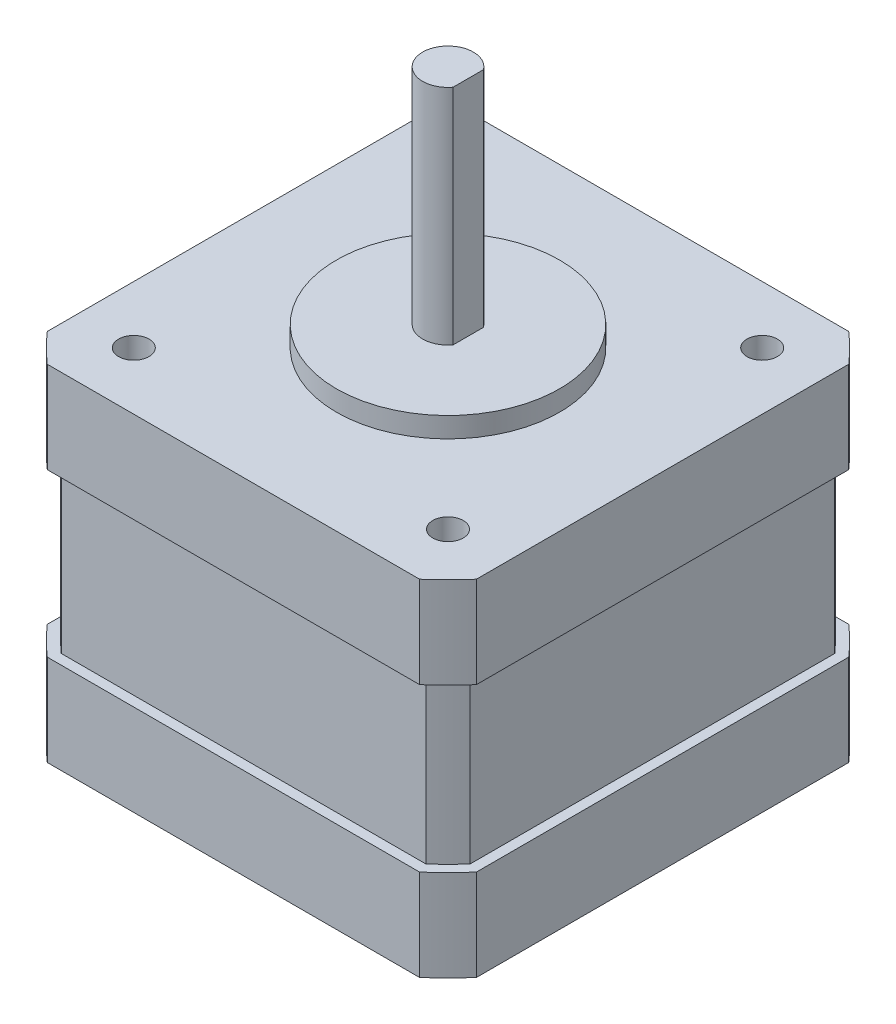
ISO-10303-21;
HEADER;
FILE_DESCRIPTION(('STEP AP214'),'2;1');
FILE_NAME('part.step','',(''),(''),'','','');
FILE_SCHEMA(('AUTOMOTIVE_DESIGN { 1 0 10303 214 1 1 1 1 }'));
ENDSEC;
DATA;
#1=APPLICATION_CONTEXT('core data for automotive mechanical design processes');
#2=APPLICATION_PROTOCOL_DEFINITION('international standard','automotive_design',2000,#1);
#3=PRODUCT_CONTEXT('',#1,'mechanical');
#4=PRODUCT('Part','Part','',(#3));
#5=PRODUCT_RELATED_PRODUCT_CATEGORY('part','',(#4));
#6=PRODUCT_DEFINITION_FORMATION('','',#4);
#7=PRODUCT_DEFINITION_CONTEXT('part definition',#1,'design');
#8=PRODUCT_DEFINITION('design','',#6,#7);
#9=PRODUCT_DEFINITION_SHAPE('','',#8);
#10=(LENGTH_UNIT() NAMED_UNIT(*) SI_UNIT(.MILLI.,.METRE.));
#11=(NAMED_UNIT(*) PLANE_ANGLE_UNIT() SI_UNIT($,.RADIAN.));
#12=(NAMED_UNIT(*) SI_UNIT($,.STERADIAN.) SOLID_ANGLE_UNIT());
#13=UNCERTAINTY_MEASURE_WITH_UNIT(LENGTH_MEASURE(1.E-05),#10,'distance_accuracy_value','');
#14=(GEOMETRIC_REPRESENTATION_CONTEXT(3) GLOBAL_UNCERTAINTY_ASSIGNED_CONTEXT((#13)) GLOBAL_UNIT_ASSIGNED_CONTEXT((#10,
#11,#12)) REPRESENTATION_CONTEXT('',''));
#15=CARTESIAN_POINT('',(0.,0.,0.));
#16=DIRECTION('',(0.,0.,1.));
#17=DIRECTION('',(1.,0.,0.));
#18=AXIS2_PLACEMENT_3D('',#15,#16,#17);
#19=CARTESIAN_POINT('',(0.,-9.,0.));
#20=DIRECTION('',(0.,1.,0.));
#21=DIRECTION('',(0.,0.,1.));
#22=AXIS2_PLACEMENT_3D('',#19,#20,#21);
#23=PLANE('',#22);
#24=CARTESIAN_POINT('',(0.,-9.,0.));
#25=DIRECTION('',(0.,1.,0.));
#26=DIRECTION('',(0.,0.,1.));
#27=AXIS2_PLACEMENT_3D('',#24,#25,#26);
#28=CIRCLE('',#27,28.);
#29=CARTESIAN_POINT('',(21.15,-9.,-18.3487738009928));
#30=VERTEX_POINT('',#29);
#31=CARTESIAN_POINT('',(18.3487738009928,-9.,-21.15));
#32=VERTEX_POINT('',#31);
#33=EDGE_CURVE('E304',#30,#32,#28,.T.);
#34=ORIENTED_EDGE('',*,*,#33,.F.);
#35=DIRECTION('',(0.,0.,-1.));
#36=VECTOR('',#35,1.);
#37=CARTESIAN_POINT('',(21.15,-9.,-18.3487738009928));
#38=LINE('',#37,#36);
#39=CARTESIAN_POINT('',(21.15,-9.,18.3487738009928));
#40=VERTEX_POINT('',#39);
#41=EDGE_CURVE('E326',#40,#30,#38,.T.);
#42=ORIENTED_EDGE('',*,*,#41,.F.);
#43=CARTESIAN_POINT('',(0.,-9.,0.));
#44=DIRECTION('',(0.,1.,0.));
#45=DIRECTION('',(0.,0.,1.));
#46=AXIS2_PLACEMENT_3D('',#43,#44,#45);
#47=CIRCLE('',#46,28.);
#48=CARTESIAN_POINT('',(18.3487738009928,-9.,21.15));
#49=VERTEX_POINT('',#48);
#50=EDGE_CURVE('E323',#49,#40,#47,.T.);
#51=ORIENTED_EDGE('',*,*,#50,.F.);
#52=DIRECTION('',(1.,0.,0.));
#53=VECTOR('',#52,1.);
#54=CARTESIAN_POINT('',(-18.3487738009928,-9.,21.15));
#55=LINE('',#54,#53);
#56=CARTESIAN_POINT('',(-18.3487738009928,-9.,21.15));
#57=VERTEX_POINT('',#56);
#58=EDGE_CURVE('E320',#57,#49,#55,.T.);
#59=ORIENTED_EDGE('',*,*,#58,.F.);
#60=CARTESIAN_POINT('',(0.,-9.,0.));
#61=DIRECTION('',(0.,1.,0.));
#62=DIRECTION('',(0.,0.,1.));
#63=AXIS2_PLACEMENT_3D('',#60,#61,#62);
#64=CIRCLE('',#63,28.);
#65=CARTESIAN_POINT('',(-21.15,-9.,18.3487738009928));
#66=VERTEX_POINT('',#65);
#67=EDGE_CURVE('E317',#66,#57,#64,.T.);
#68=ORIENTED_EDGE('',*,*,#67,.F.);
#69=DIRECTION('',(0.,0.,1.));
#70=VECTOR('',#69,1.);
#71=CARTESIAN_POINT('',(-21.15,-9.,-18.3487738009928));
#72=LINE('',#71,#70);
#73=CARTESIAN_POINT('',(-21.15,-9.,-18.3487738009928));
#74=VERTEX_POINT('',#73);
#75=EDGE_CURVE('E314',#74,#66,#72,.T.);
#76=ORIENTED_EDGE('',*,*,#75,.F.);
#77=CARTESIAN_POINT('',(0.,-9.,0.));
#78=DIRECTION('',(0.,1.,0.));
#79=DIRECTION('',(0.,0.,1.));
#80=AXIS2_PLACEMENT_3D('',#77,#78,#79);
#81=CIRCLE('',#80,28.);
#82=CARTESIAN_POINT('',(-18.3487738009928,-9.,-21.15));
#83=VERTEX_POINT('',#82);
#84=EDGE_CURVE('E311',#83,#74,#81,.T.);
#85=ORIENTED_EDGE('',*,*,#84,.F.);
#86=DIRECTION('',(-1.,0.,0.));
#87=VECTOR('',#86,1.);
#88=CARTESIAN_POINT('',(-18.3487738009928,-9.,-21.15));
#89=LINE('',#88,#87);
#90=EDGE_CURVE('E307',#32,#83,#89,.T.);
#91=ORIENTED_EDGE('',*,*,#90,.F.);
#92=EDGE_LOOP('',(#34,#42,#51,#59,#68,#76,#85,#91));
#93=FACE_BOUND('',#92,.T.);
#94=CARTESIAN_POINT('',(0.,-9.,0.));
#95=DIRECTION('',(0.,-1.,0.));
#96=DIRECTION('',(0.,0.,-1.));
#97=AXIS2_PLACEMENT_3D('',#94,#95,#96);
#98=CIRCLE('',#97,27.);
#99=CARTESIAN_POINT('',(17.9715747779653,-9.,-20.15));
#100=VERTEX_POINT('',#99);
#101=CARTESIAN_POINT('',(20.15,-9.,-17.9715747779653));
#102=VERTEX_POINT('',#101);
#103=EDGE_CURVE('E231',#100,#102,#98,.T.);
#104=ORIENTED_EDGE('',*,*,#103,.F.);
#105=DIRECTION('',(1.,0.,0.));
#106=VECTOR('',#105,1.);
#107=CARTESIAN_POINT('',(-17.9715747779654,-9.,-20.15));
#108=LINE('',#107,#106);
#109=CARTESIAN_POINT('',(-17.9715747779654,-9.,-20.15));
#110=VERTEX_POINT('',#109);
#111=EDGE_CURVE('E243',#110,#100,#108,.T.);
#112=ORIENTED_EDGE('',*,*,#111,.F.);
#113=CARTESIAN_POINT('',(0.,-9.,0.));
#114=DIRECTION('',(0.,-1.,0.));
#115=DIRECTION('',(0.,0.,-1.));
#116=AXIS2_PLACEMENT_3D('',#113,#114,#115);
#117=CIRCLE('',#116,27.);
#118=CARTESIAN_POINT('',(-20.15,-9.,-17.9715747779653));
#119=VERTEX_POINT('',#118);
#120=EDGE_CURVE('E276',#119,#110,#117,.T.);
#121=ORIENTED_EDGE('',*,*,#120,.F.);
#122=DIRECTION('',(0.,0.,-1.));
#123=VECTOR('',#122,1.);
#124=CARTESIAN_POINT('',(-20.15,-9.,17.9715747779653));
#125=LINE('',#124,#123);
#126=CARTESIAN_POINT('',(-20.15,-9.,17.9715747779653));
#127=VERTEX_POINT('',#126);
#128=EDGE_CURVE('E273',#127,#119,#125,.T.);
#129=ORIENTED_EDGE('',*,*,#128,.F.);
#130=CARTESIAN_POINT('',(0.,-9.,0.));
#131=DIRECTION('',(0.,-1.,0.));
#132=DIRECTION('',(0.,0.,-1.));
#133=AXIS2_PLACEMENT_3D('',#130,#131,#132);
#134=CIRCLE('',#133,27.);
#135=CARTESIAN_POINT('',(-17.9715747779654,-9.,20.15));
#136=VERTEX_POINT('',#135);
#137=EDGE_CURVE('E270',#136,#127,#134,.T.);
#138=ORIENTED_EDGE('',*,*,#137,.F.);
#139=DIRECTION('',(-1.,0.,0.));
#140=VECTOR('',#139,1.);
#141=CARTESIAN_POINT('',(17.9715747779653,-9.,20.15));
#142=LINE('',#141,#140);
#143=CARTESIAN_POINT('',(17.9715747779653,-9.,20.15));
#144=VERTEX_POINT('',#143);
#145=EDGE_CURVE('E267',#144,#136,#142,.T.);
#146=ORIENTED_EDGE('',*,*,#145,.F.);
#147=CARTESIAN_POINT('',(0.,-9.,0.));
#148=DIRECTION('',(0.,-1.,0.));
#149=DIRECTION('',(0.,0.,-1.));
#150=AXIS2_PLACEMENT_3D('',#147,#148,#149);
#151=CIRCLE('',#150,27.);
#152=CARTESIAN_POINT('',(20.15,-9.,17.9715747779653));
#153=VERTEX_POINT('',#152);
#154=EDGE_CURVE('E55',#153,#144,#151,.T.);
#155=ORIENTED_EDGE('',*,*,#154,.F.);
#156=DIRECTION('',(0.,0.,1.));
#157=VECTOR('',#156,1.);
#158=CARTESIAN_POINT('',(20.15,-9.,-17.9715747779653));
#159=LINE('',#158,#157);
#160=EDGE_CURVE('E50',#102,#153,#159,.T.);
#161=ORIENTED_EDGE('',*,*,#160,.F.);
#162=EDGE_LOOP('',(#104,#112,#121,#129,#138,#146,#155,#161));
#163=FACE_BOUND('',#162,.T.);
#164=ADVANCED_FACE('F35',(#93,#163),#23,.F.);
#165=CARTESIAN_POINT('',(0.,24.,0.));
#166=DIRECTION('',(0.,-1.,0.));
#167=DIRECTION('',(0.,0.,-1.));
#168=AXIS2_PLACEMENT_3D('',#165,#166,#167);
#169=CYLINDRICAL_SURFACE('',#168,2.5);
#170=DIRECTION('',(0.,-1.,0.));
#171=VECTOR('',#170,1.);
#172=CARTESIAN_POINT('',(2.,24.,-1.5));
#173=LINE('',#172,#171);
#174=CARTESIAN_POINT('',(2.,24.,-1.5));
#175=VERTEX_POINT('',#174);
#176=CARTESIAN_POINT('',(2.,2.,-1.5));
#177=VERTEX_POINT('',#176);
#178=EDGE_CURVE('E381',#175,#177,#173,.T.);
#179=ORIENTED_EDGE('',*,*,#178,.T.);
#180=CARTESIAN_POINT('',(0.,2.,0.));
#181=DIRECTION('',(0.,1.,0.));
#182=DIRECTION('',(0.,0.,1.));
#183=AXIS2_PLACEMENT_3D('',#180,#181,#182);
#184=CIRCLE('',#183,2.5);
#185=CARTESIAN_POINT('',(2.,2.,1.5));
#186=VERTEX_POINT('',#185);
#187=EDGE_CURVE('E373',#177,#186,#184,.T.);
#188=ORIENTED_EDGE('',*,*,#187,.T.);
#189=DIRECTION('',(0.,-1.,0.));
#190=VECTOR('',#189,1.);
#191=CARTESIAN_POINT('',(2.,24.,1.5));
#192=LINE('',#191,#190);
#193=CARTESIAN_POINT('',(2.,24.,1.5));
#194=VERTEX_POINT('',#193);
#195=EDGE_CURVE('E43',#194,#186,#192,.T.);
#196=ORIENTED_EDGE('',*,*,#195,.F.);
#197=CARTESIAN_POINT('',(0.,24.,0.));
#198=DIRECTION('',(0.,1.,0.));
#199=DIRECTION('',(0.,0.,1.));
#200=AXIS2_PLACEMENT_3D('',#197,#198,#199);
#201=CIRCLE('',#200,2.5);
#202=EDGE_CURVE('E376',#175,#194,#201,.T.);
#203=ORIENTED_EDGE('',*,*,#202,.F.);
#204=EDGE_LOOP('',(#179,#188,#196,#203));
#205=FACE_BOUND('',#204,.T.);
#206=ADVANCED_FACE('F37',(#205),#169,.T.);
#207=CARTESIAN_POINT('',(2.,24.,-1.5));
#208=DIRECTION('',(-1.,0.,0.));
#209=DIRECTION('',(0.,0.,1.));
#210=AXIS2_PLACEMENT_3D('',#207,#208,#209);
#211=PLANE('',#210);
#212=ORIENTED_EDGE('',*,*,#195,.T.);
#213=DIRECTION('',(0.,0.,-1.));
#214=VECTOR('',#213,1.);
#215=CARTESIAN_POINT('',(2.,2.,-1.5));
#216=LINE('',#215,#214);
#217=EDGE_CURVE('E11',#186,#177,#216,.T.);
#218=ORIENTED_EDGE('',*,*,#217,.T.);
#219=ORIENTED_EDGE('',*,*,#178,.F.);
#220=DIRECTION('',(0.,0.,-1.));
#221=VECTOR('',#220,1.);
#222=CARTESIAN_POINT('',(2.,24.,-1.5));
#223=LINE('',#222,#221);
#224=EDGE_CURVE('E379',#194,#175,#223,.T.);
#225=ORIENTED_EDGE('',*,*,#224,.F.);
#226=EDGE_LOOP('',(#212,#218,#219,#225));
#227=FACE_BOUND('',#226,.T.);
#228=ADVANCED_FACE('F386',(#227),#211,.F.);
#229=CARTESIAN_POINT('',(0.,24.,0.));
#230=DIRECTION('',(0.,1.,0.));
#231=DIRECTION('',(0.,0.,1.));
#232=AXIS2_PLACEMENT_3D('',#229,#230,#231);
#233=PLANE('',#232);
#234=ORIENTED_EDGE('',*,*,#202,.T.);
#235=ORIENTED_EDGE('',*,*,#224,.T.);
#236=EDGE_LOOP('',(#234,#235));
#237=FACE_BOUND('',#236,.T.);
#238=ADVANCED_FACE('F394',(#237),#233,.T.);
#239=CARTESIAN_POINT('',(0.,2.,0.));
#240=DIRECTION('',(0.,1.,0.));
#241=DIRECTION('',(0.,0.,1.));
#242=AXIS2_PLACEMENT_3D('',#239,#240,#241);
#243=PLANE('',#242);
#244=CARTESIAN_POINT('',(0.,2.,0.));
#245=DIRECTION('',(0.,1.,0.));
#246=DIRECTION('',(0.,0.,1.));
#247=AXIS2_PLACEMENT_3D('',#244,#245,#246);
#248=CIRCLE('',#247,11.);
#249=CARTESIAN_POINT('',(0.,2.,11.));
#250=VERTEX_POINT('',#249);
#251=EDGE_CURVE('E370',#250,#250,#248,.T.);
#252=ORIENTED_EDGE('',*,*,#251,.T.);
#253=EDGE_LOOP('',(#252));
#254=FACE_BOUND('',#253,.T.);
#255=ORIENTED_EDGE('',*,*,#187,.F.);
#256=ORIENTED_EDGE('',*,*,#217,.F.);
#257=EDGE_LOOP('',(#255,#256));
#258=FACE_BOUND('',#257,.T.);
#259=ADVANCED_FACE('F391',(#254,#258),#243,.T.);
#260=CARTESIAN_POINT('',(0.,2.,0.));
#261=DIRECTION('',(0.,-1.,0.));
#262=DIRECTION('',(0.,0.,-1.));
#263=AXIS2_PLACEMENT_3D('',#260,#261,#262);
#264=CYLINDRICAL_SURFACE('',#263,11.);
#265=ORIENTED_EDGE('',*,*,#251,.F.);
#266=EDGE_LOOP('',(#265));
#267=FACE_BOUND('',#266,.T.);
#268=CARTESIAN_POINT('',(0.,0.,0.));
#269=DIRECTION('',(0.,1.,0.));
#270=DIRECTION('',(0.,0.,1.));
#271=AXIS2_PLACEMENT_3D('',#268,#269,#270);
#272=CIRCLE('',#271,11.);
#273=CARTESIAN_POINT('',(0.,0.,11.));
#274=VERTEX_POINT('',#273);
#275=EDGE_CURVE('E354',#274,#274,#272,.T.);
#276=ORIENTED_EDGE('',*,*,#275,.T.);
#277=EDGE_LOOP('',(#276));
#278=FACE_BOUND('',#277,.T.);
#279=ADVANCED_FACE('F393',(#267,#278),#264,.T.);
#280=CARTESIAN_POINT('',(0.,0.,0.));
#281=DIRECTION('',(0.,1.,0.));
#282=DIRECTION('',(0.,0.,1.));
#283=AXIS2_PLACEMENT_3D('',#280,#281,#282);
#284=PLANE('',#283);
#285=CARTESIAN_POINT('',(-15.4856385079845,0.,15.4856385079854));
#286=DIRECTION('',(0.,1.,0.));
#287=DIRECTION('',(0.,0.,1.));
#288=AXIS2_PLACEMENT_3D('',#285,#286,#287);
#289=CIRCLE('',#288,1.50000000000045);
#290=CARTESIAN_POINT('',(-15.4856385079845,0.,16.9856385079859));
#291=VERTEX_POINT('',#290);
#292=EDGE_CURVE('E828',#291,#291,#289,.T.);
#293=ORIENTED_EDGE('',*,*,#292,.F.);
#294=EDGE_LOOP('',(#293));
#295=FACE_BOUND('',#294,.T.);
#296=CARTESIAN_POINT('',(15.4856385079863,0.,15.4856385079845));
#297=DIRECTION('',(0.,1.,0.));
#298=DIRECTION('',(0.,0.,1.));
#299=AXIS2_PLACEMENT_3D('',#296,#297,#298);
#300=CIRCLE('',#299,1.5000000000012);
#301=CARTESIAN_POINT('',(15.4856385079863,0.,16.9856385079857));
#302=VERTEX_POINT('',#301);
#303=EDGE_CURVE('E827',#302,#302,#300,.T.);
#304=ORIENTED_EDGE('',*,*,#303,.F.);
#305=EDGE_LOOP('',(#304));
#306=FACE_BOUND('',#305,.T.);
#307=CARTESIAN_POINT('',(15.4856385079854,0.,-15.4856385079863));
#308=DIRECTION('',(0.,1.,0.));
#309=DIRECTION('',(0.,0.,1.));
#310=AXIS2_PLACEMENT_3D('',#307,#308,#309);
#311=CIRCLE('',#310,1.50000000000088);
#312=CARTESIAN_POINT('',(15.4856385079854,0.,-13.9856385079854));
#313=VERTEX_POINT('',#312);
#314=EDGE_CURVE('E837',#313,#313,#311,.T.);
#315=ORIENTED_EDGE('',*,*,#314,.F.);
#316=EDGE_LOOP('',(#315));
#317=FACE_BOUND('',#316,.T.);
#318=CARTESIAN_POINT('',(-15.4856385079854,0.,-15.4856385079854));
#319=DIRECTION('',(0.,1.,0.));
#320=DIRECTION('',(0.,0.,1.));
#321=AXIS2_PLACEMENT_3D('',#318,#319,#320);
#322=CIRCLE('',#321,1.5);
#323=CARTESIAN_POINT('',(-15.4856385079854,0.,-13.9856385079854));
#324=VERTEX_POINT('',#323);
#325=EDGE_CURVE('E842',#324,#324,#322,.T.);
#326=ORIENTED_EDGE('',*,*,#325,.F.);
#327=EDGE_LOOP('',(#326));
#328=FACE_BOUND('',#327,.T.);
#329=CARTESIAN_POINT('',(0.,0.,0.));
#330=DIRECTION('',(0.,1.,0.));
#331=DIRECTION('',(0.,0.,1.));
#332=AXIS2_PLACEMENT_3D('',#329,#330,#331);
#333=CIRCLE('',#332,28.);
#334=CARTESIAN_POINT('',(21.15,0.,-18.3487738009928));
#335=VERTEX_POINT('',#334);
#336=CARTESIAN_POINT('',(18.3487738009928,0.,-21.15));
#337=VERTEX_POINT('',#336);
#338=EDGE_CURVE('E303',#335,#337,#333,.T.);
#339=ORIENTED_EDGE('',*,*,#338,.T.);
#340=DIRECTION('',(-1.,0.,0.));
#341=VECTOR('',#340,1.);
#342=CARTESIAN_POINT('',(-18.3487738009928,0.,-21.15));
#343=LINE('',#342,#341);
#344=CARTESIAN_POINT('',(-18.3487738009928,0.,-21.15));
#345=VERTEX_POINT('',#344);
#346=EDGE_CURVE('E332',#337,#345,#343,.T.);
#347=ORIENTED_EDGE('',*,*,#346,.T.);
#348=CARTESIAN_POINT('',(0.,0.,0.));
#349=DIRECTION('',(0.,1.,0.));
#350=DIRECTION('',(0.,0.,1.));
#351=AXIS2_PLACEMENT_3D('',#348,#349,#350);
#352=CIRCLE('',#351,28.);
#353=CARTESIAN_POINT('',(-21.15,0.,-18.3487738009928));
#354=VERTEX_POINT('',#353);
#355=EDGE_CURVE('E335',#345,#354,#352,.T.);
#356=ORIENTED_EDGE('',*,*,#355,.T.);
#357=DIRECTION('',(0.,0.,1.));
#358=VECTOR('',#357,1.);
#359=CARTESIAN_POINT('',(-21.15,0.,-18.3487738009928));
#360=LINE('',#359,#358);
#361=CARTESIAN_POINT('',(-21.15,0.,18.3487738009928));
#362=VERTEX_POINT('',#361);
#363=EDGE_CURVE('E338',#354,#362,#360,.T.);
#364=ORIENTED_EDGE('',*,*,#363,.T.);
#365=CARTESIAN_POINT('',(0.,0.,0.));
#366=DIRECTION('',(0.,1.,0.));
#367=DIRECTION('',(0.,0.,1.));
#368=AXIS2_PLACEMENT_3D('',#365,#366,#367);
#369=CIRCLE('',#368,28.);
#370=CARTESIAN_POINT('',(-18.3487738009928,0.,21.15));
#371=VERTEX_POINT('',#370);
#372=EDGE_CURVE('E341',#362,#371,#369,.T.);
#373=ORIENTED_EDGE('',*,*,#372,.T.);
#374=DIRECTION('',(1.,0.,0.));
#375=VECTOR('',#374,1.);
#376=CARTESIAN_POINT('',(-18.3487738009928,0.,21.15));
#377=LINE('',#376,#375);
#378=CARTESIAN_POINT('',(18.3487738009928,0.,21.15));
#379=VERTEX_POINT('',#378);
#380=EDGE_CURVE('E344',#371,#379,#377,.T.);
#381=ORIENTED_EDGE('',*,*,#380,.T.);
#382=CARTESIAN_POINT('',(0.,0.,0.));
#383=DIRECTION('',(0.,1.,0.));
#384=DIRECTION('',(0.,0.,1.));
#385=AXIS2_PLACEMENT_3D('',#382,#383,#384);
#386=CIRCLE('',#385,28.);
#387=CARTESIAN_POINT('',(21.15,0.,18.3487738009928));
#388=VERTEX_POINT('',#387);
#389=EDGE_CURVE('E347',#379,#388,#386,.T.);
#390=ORIENTED_EDGE('',*,*,#389,.T.);
#391=DIRECTION('',(0.,0.,-1.));
#392=VECTOR('',#391,1.);
#393=CARTESIAN_POINT('',(21.15,0.,-18.3487738009928));
#394=LINE('',#393,#392);
#395=EDGE_CURVE('E308',#388,#335,#394,.T.);
#396=ORIENTED_EDGE('',*,*,#395,.T.);
#397=EDGE_LOOP('',(#339,#347,#356,#364,#373,#381,#390,#396));
#398=FACE_BOUND('',#397,.T.);
#399=ORIENTED_EDGE('',*,*,#275,.F.);
#400=EDGE_LOOP('',(#399));
#401=FACE_BOUND('',#400,.T.);
#402=ADVANCED_FACE('F401',(#295,#306,#317,#328,#398,#401),#284,.T.);
#403=CARTESIAN_POINT('',(0.,-9.,0.));
#404=DIRECTION('',(0.,1.,0.));
#405=DIRECTION('',(0.,0.,1.));
#406=AXIS2_PLACEMENT_3D('',#403,#404,#405);
#407=CYLINDRICAL_SURFACE('',#406,28.);
#408=ORIENTED_EDGE('',*,*,#338,.F.);
#409=DIRECTION('',(0.,1.,0.));
#410=VECTOR('',#409,1.);
#411=CARTESIAN_POINT('',(21.15,-9.,-18.3487738009928));
#412=LINE('',#411,#410);
#413=EDGE_CURVE('E352',#30,#335,#412,.T.);
#414=ORIENTED_EDGE('',*,*,#413,.F.);
#415=ORIENTED_EDGE('',*,*,#33,.T.);
#416=DIRECTION('',(0.,1.,0.));
#417=VECTOR('',#416,1.);
#418=CARTESIAN_POINT('',(18.3487738009928,-9.,-21.15));
#419=LINE('',#418,#417);
#420=EDGE_CURVE('E329',#32,#337,#419,.T.);
#421=ORIENTED_EDGE('',*,*,#420,.T.);
#422=EDGE_LOOP('',(#408,#414,#415,#421));
#423=FACE_BOUND('',#422,.T.);
#424=ADVANCED_FACE('F420',(#423),#407,.T.);
#425=CARTESIAN_POINT('',(21.15,-9.,-18.3487738009928));
#426=DIRECTION('',(1.,0.,0.));
#427=DIRECTION('',(0.,0.,-1.));
#428=AXIS2_PLACEMENT_3D('',#425,#426,#427);
#429=PLANE('',#428);
#430=ORIENTED_EDGE('',*,*,#395,.F.);
#431=DIRECTION('',(0.,1.,0.));
#432=VECTOR('',#431,1.);
#433=CARTESIAN_POINT('',(21.15,-9.,18.3487738009928));
#434=LINE('',#433,#432);
#435=EDGE_CURVE('E355',#40,#388,#434,.T.);
#436=ORIENTED_EDGE('',*,*,#435,.F.);
#437=ORIENTED_EDGE('',*,*,#41,.T.);
#438=ORIENTED_EDGE('',*,*,#413,.T.);
#439=EDGE_LOOP('',(#430,#436,#437,#438));
#440=FACE_BOUND('',#439,.T.);
#441=ADVANCED_FACE('F422',(#440),#429,.T.);
#442=CARTESIAN_POINT('',(0.,-9.,0.));
#443=DIRECTION('',(0.,1.,0.));
#444=DIRECTION('',(0.,0.,1.));
#445=AXIS2_PLACEMENT_3D('',#442,#443,#444);
#446=CYLINDRICAL_SURFACE('',#445,28.);
#447=ORIENTED_EDGE('',*,*,#389,.F.);
#448=DIRECTION('',(0.,1.,0.));
#449=VECTOR('',#448,1.);
#450=CARTESIAN_POINT('',(18.3487738009928,-9.,21.15));
#451=LINE('',#450,#449);
#452=EDGE_CURVE('E357',#49,#379,#451,.T.);
#453=ORIENTED_EDGE('',*,*,#452,.F.);
#454=ORIENTED_EDGE('',*,*,#50,.T.);
#455=ORIENTED_EDGE('',*,*,#435,.T.);
#456=EDGE_LOOP('',(#447,#453,#454,#455));
#457=FACE_BOUND('',#456,.T.);
#458=ADVANCED_FACE('F425',(#457),#446,.T.);
#459=CARTESIAN_POINT('',(-18.3487738009928,-9.,21.15));
#460=DIRECTION('',(0.,0.,1.));
#461=DIRECTION('',(1.,0.,0.));
#462=AXIS2_PLACEMENT_3D('',#459,#460,#461);
#463=PLANE('',#462);
#464=ORIENTED_EDGE('',*,*,#380,.F.);
#465=DIRECTION('',(0.,1.,0.));
#466=VECTOR('',#465,1.);
#467=CARTESIAN_POINT('',(-18.3487738009928,-9.,21.15));
#468=LINE('',#467,#466);
#469=EDGE_CURVE('E359',#57,#371,#468,.T.);
#470=ORIENTED_EDGE('',*,*,#469,.F.);
#471=ORIENTED_EDGE('',*,*,#58,.T.);
#472=ORIENTED_EDGE('',*,*,#452,.T.);
#473=EDGE_LOOP('',(#464,#470,#471,#472));
#474=FACE_BOUND('',#473,.T.);
#475=ADVANCED_FACE('F429',(#474),#463,.T.);
#476=CARTESIAN_POINT('',(0.,-9.,0.));
#477=DIRECTION('',(0.,1.,0.));
#478=DIRECTION('',(0.,0.,1.));
#479=AXIS2_PLACEMENT_3D('',#476,#477,#478);
#480=CYLINDRICAL_SURFACE('',#479,28.);
#481=ORIENTED_EDGE('',*,*,#372,.F.);
#482=DIRECTION('',(0.,1.,0.));
#483=VECTOR('',#482,1.);
#484=CARTESIAN_POINT('',(-21.15,-9.,18.3487738009928));
#485=LINE('',#484,#483);
#486=EDGE_CURVE('E361',#66,#362,#485,.T.);
#487=ORIENTED_EDGE('',*,*,#486,.F.);
#488=ORIENTED_EDGE('',*,*,#67,.T.);
#489=ORIENTED_EDGE('',*,*,#469,.T.);
#490=EDGE_LOOP('',(#481,#487,#488,#489));
#491=FACE_BOUND('',#490,.T.);
#492=ADVANCED_FACE('F433',(#491),#480,.T.);
#493=CARTESIAN_POINT('',(-21.15,-9.,-18.3487738009928));
#494=DIRECTION('',(-1.,0.,0.));
#495=DIRECTION('',(0.,0.,1.));
#496=AXIS2_PLACEMENT_3D('',#493,#494,#495);
#497=PLANE('',#496);
#498=ORIENTED_EDGE('',*,*,#363,.F.);
#499=DIRECTION('',(0.,1.,0.));
#500=VECTOR('',#499,1.);
#501=CARTESIAN_POINT('',(-21.15,-9.,-18.3487738009928));
#502=LINE('',#501,#500);
#503=EDGE_CURVE('E363',#74,#354,#502,.T.);
#504=ORIENTED_EDGE('',*,*,#503,.F.);
#505=ORIENTED_EDGE('',*,*,#75,.T.);
#506=ORIENTED_EDGE('',*,*,#486,.T.);
#507=EDGE_LOOP('',(#498,#504,#505,#506));
#508=FACE_BOUND('',#507,.T.);
#509=ADVANCED_FACE('F437',(#508),#497,.T.);
#510=CARTESIAN_POINT('',(0.,-9.,0.));
#511=DIRECTION('',(0.,1.,0.));
#512=DIRECTION('',(0.,0.,1.));
#513=AXIS2_PLACEMENT_3D('',#510,#511,#512);
#514=CYLINDRICAL_SURFACE('',#513,28.);
#515=ORIENTED_EDGE('',*,*,#355,.F.);
#516=DIRECTION('',(0.,1.,0.));
#517=VECTOR('',#516,1.);
#518=CARTESIAN_POINT('',(-18.3487738009928,-9.,-21.15));
#519=LINE('',#518,#517);
#520=EDGE_CURVE('E365',#83,#345,#519,.T.);
#521=ORIENTED_EDGE('',*,*,#520,.F.);
#522=ORIENTED_EDGE('',*,*,#84,.T.);
#523=ORIENTED_EDGE('',*,*,#503,.T.);
#524=EDGE_LOOP('',(#515,#521,#522,#523));
#525=FACE_BOUND('',#524,.T.);
#526=ADVANCED_FACE('F441',(#525),#514,.T.);
#527=CARTESIAN_POINT('',(-18.3487738009928,-9.,-21.15));
#528=DIRECTION('',(0.,0.,-1.));
#529=DIRECTION('',(-1.,0.,0.));
#530=AXIS2_PLACEMENT_3D('',#527,#528,#529);
#531=PLANE('',#530);
#532=ORIENTED_EDGE('',*,*,#346,.F.);
#533=ORIENTED_EDGE('',*,*,#420,.F.);
#534=ORIENTED_EDGE('',*,*,#90,.T.);
#535=ORIENTED_EDGE('',*,*,#520,.T.);
#536=EDGE_LOOP('',(#532,#533,#534,#535));
#537=FACE_BOUND('',#536,.T.);
#538=ADVANCED_FACE('F445',(#537),#531,.T.);
#539=CARTESIAN_POINT('',(0.,-25.,0.));
#540=DIRECTION('',(0.,1.,0.));
#541=DIRECTION('',(0.,0.,1.));
#542=AXIS2_PLACEMENT_3D('',#539,#540,#541);
#543=CYLINDRICAL_SURFACE('',#542,27.);
#544=ORIENTED_EDGE('',*,*,#103,.T.);
#545=DIRECTION('',(0.,1.,0.));
#546=VECTOR('',#545,1.);
#547=CARTESIAN_POINT('',(20.15,-25.,-17.9715747779653));
#548=LINE('',#547,#546);
#549=CARTESIAN_POINT('',(20.15,-25.,-17.9715747779653));
#550=VERTEX_POINT('',#549);
#551=EDGE_CURVE('E301',#550,#102,#548,.T.);
#552=ORIENTED_EDGE('',*,*,#551,.F.);
#553=CARTESIAN_POINT('',(0.,-25.,0.));
#554=DIRECTION('',(0.,-1.,0.));
#555=DIRECTION('',(0.,0.,-1.));
#556=AXIS2_PLACEMENT_3D('',#553,#554,#555);
#557=CIRCLE('',#556,27.);
#558=CARTESIAN_POINT('',(17.9715747779653,-25.,-20.15));
#559=VERTEX_POINT('',#558);
#560=EDGE_CURVE('E239',#559,#550,#557,.T.);
#561=ORIENTED_EDGE('',*,*,#560,.F.);
#562=DIRECTION('',(0.,1.,0.));
#563=VECTOR('',#562,1.);
#564=CARTESIAN_POINT('',(17.9715747779653,-25.,-20.15));
#565=LINE('',#564,#563);
#566=EDGE_CURVE('E263',#559,#100,#565,.T.);
#567=ORIENTED_EDGE('',*,*,#566,.T.);
#568=EDGE_LOOP('',(#544,#552,#561,#567));
#569=FACE_BOUND('',#568,.T.);
#570=ADVANCED_FACE('F416',(#569),#543,.T.);
#571=CARTESIAN_POINT('',(20.15,-25.,-17.9715747779653));
#572=DIRECTION('',(-1.,0.,0.));
#573=DIRECTION('',(0.,0.,1.));
#574=AXIS2_PLACEMENT_3D('',#571,#572,#573);
#575=PLANE('',#574);
#576=ORIENTED_EDGE('',*,*,#160,.T.);
#577=DIRECTION('',(0.,1.,0.));
#578=VECTOR('',#577,1.);
#579=CARTESIAN_POINT('',(20.15,-25.,17.9715747779653));
#580=LINE('',#579,#578);
#581=CARTESIAN_POINT('',(20.15,-25.,17.9715747779653));
#582=VERTEX_POINT('',#581);
#583=EDGE_CURVE('E298',#582,#153,#580,.T.);
#584=ORIENTED_EDGE('',*,*,#583,.F.);
#585=DIRECTION('',(0.,0.,1.));
#586=VECTOR('',#585,1.);
#587=CARTESIAN_POINT('',(20.15,-25.,-17.9715747779653));
#588=LINE('',#587,#586);
#589=EDGE_CURVE('E242',#550,#582,#588,.T.);
#590=ORIENTED_EDGE('',*,*,#589,.F.);
#591=ORIENTED_EDGE('',*,*,#551,.T.);
#592=EDGE_LOOP('',(#576,#584,#590,#591));
#593=FACE_BOUND('',#592,.T.);
#594=ADVANCED_FACE('F511',(#593),#575,.F.);
#595=CARTESIAN_POINT('',(0.,-25.,0.));
#596=DIRECTION('',(0.,1.,0.));
#597=DIRECTION('',(0.,0.,1.));
#598=AXIS2_PLACEMENT_3D('',#595,#596,#597);
#599=CYLINDRICAL_SURFACE('',#598,27.);
#600=ORIENTED_EDGE('',*,*,#154,.T.);
#601=DIRECTION('',(0.,1.,0.));
#602=VECTOR('',#601,1.);
#603=CARTESIAN_POINT('',(17.9715747779653,-25.,20.15));
#604=LINE('',#603,#602);
#605=CARTESIAN_POINT('',(17.9715747779653,-25.,20.15));
#606=VERTEX_POINT('',#605);
#607=EDGE_CURVE('E295',#606,#144,#604,.T.);
#608=ORIENTED_EDGE('',*,*,#607,.F.);
#609=CARTESIAN_POINT('',(0.,-25.,0.));
#610=DIRECTION('',(0.,-1.,0.));
#611=DIRECTION('',(0.,0.,-1.));
#612=AXIS2_PLACEMENT_3D('',#609,#610,#611);
#613=CIRCLE('',#612,27.);
#614=EDGE_CURVE('E246',#582,#606,#613,.T.);
#615=ORIENTED_EDGE('',*,*,#614,.F.);
#616=ORIENTED_EDGE('',*,*,#583,.T.);
#617=EDGE_LOOP('',(#600,#608,#615,#616));
#618=FACE_BOUND('',#617,.T.);
#619=ADVANCED_FACE('F518',(#618),#599,.T.);
#620=CARTESIAN_POINT('',(17.9715747779653,-25.,20.15));
#621=DIRECTION('',(0.,0.,-1.));
#622=DIRECTION('',(-1.,0.,0.));
#623=AXIS2_PLACEMENT_3D('',#620,#621,#622);
#624=PLANE('',#623);
#625=ORIENTED_EDGE('',*,*,#145,.T.);
#626=DIRECTION('',(0.,1.,0.));
#627=VECTOR('',#626,1.);
#628=CARTESIAN_POINT('',(-17.9715747779654,-25.,20.15));
#629=LINE('',#628,#627);
#630=CARTESIAN_POINT('',(-17.9715747779654,-25.,20.15));
#631=VERTEX_POINT('',#630);
#632=EDGE_CURVE('E292',#631,#136,#629,.T.);
#633=ORIENTED_EDGE('',*,*,#632,.F.);
#634=DIRECTION('',(-1.,0.,0.));
#635=VECTOR('',#634,1.);
#636=CARTESIAN_POINT('',(17.9715747779653,-25.,20.15));
#637=LINE('',#636,#635);
#638=EDGE_CURVE('E249',#606,#631,#637,.T.);
#639=ORIENTED_EDGE('',*,*,#638,.F.);
#640=ORIENTED_EDGE('',*,*,#607,.T.);
#641=EDGE_LOOP('',(#625,#633,#639,#640));
#642=FACE_BOUND('',#641,.T.);
#643=ADVANCED_FACE('F525',(#642),#624,.F.);
#644=CARTESIAN_POINT('',(0.,-25.,0.));
#645=DIRECTION('',(0.,1.,0.));
#646=DIRECTION('',(0.,0.,1.));
#647=AXIS2_PLACEMENT_3D('',#644,#645,#646);
#648=CYLINDRICAL_SURFACE('',#647,27.);
#649=ORIENTED_EDGE('',*,*,#137,.T.);
#650=DIRECTION('',(0.,1.,0.));
#651=VECTOR('',#650,1.);
#652=CARTESIAN_POINT('',(-20.15,-25.,17.9715747779653));
#653=LINE('',#652,#651);
#654=CARTESIAN_POINT('',(-20.15,-25.,17.9715747779653));
#655=VERTEX_POINT('',#654);
#656=EDGE_CURVE('E289',#655,#127,#653,.T.);
#657=ORIENTED_EDGE('',*,*,#656,.F.);
#658=CARTESIAN_POINT('',(0.,-25.,0.));
#659=DIRECTION('',(0.,-1.,0.));
#660=DIRECTION('',(0.,0.,-1.));
#661=AXIS2_PLACEMENT_3D('',#658,#659,#660);
#662=CIRCLE('',#661,27.);
#663=EDGE_CURVE('E252',#631,#655,#662,.T.);
#664=ORIENTED_EDGE('',*,*,#663,.F.);
#665=ORIENTED_EDGE('',*,*,#632,.T.);
#666=EDGE_LOOP('',(#649,#657,#664,#665));
#667=FACE_BOUND('',#666,.T.);
#668=ADVANCED_FACE('F533',(#667),#648,.T.);
#669=CARTESIAN_POINT('',(-20.15,-25.,17.9715747779653));
#670=DIRECTION('',(1.,0.,0.));
#671=DIRECTION('',(0.,0.,-1.));
#672=AXIS2_PLACEMENT_3D('',#669,#670,#671);
#673=PLANE('',#672);
#674=ORIENTED_EDGE('',*,*,#128,.T.);
#675=DIRECTION('',(0.,1.,0.));
#676=VECTOR('',#675,1.);
#677=CARTESIAN_POINT('',(-20.15,-25.,-17.9715747779653));
#678=LINE('',#677,#676);
#679=CARTESIAN_POINT('',(-20.15,-25.,-17.9715747779653));
#680=VERTEX_POINT('',#679);
#681=EDGE_CURVE('E286',#680,#119,#678,.T.);
#682=ORIENTED_EDGE('',*,*,#681,.F.);
#683=DIRECTION('',(0.,0.,-1.));
#684=VECTOR('',#683,1.);
#685=CARTESIAN_POINT('',(-20.15,-25.,17.9715747779653));
#686=LINE('',#685,#684);
#687=EDGE_CURVE('E255',#655,#680,#686,.T.);
#688=ORIENTED_EDGE('',*,*,#687,.F.);
#689=ORIENTED_EDGE('',*,*,#656,.T.);
#690=EDGE_LOOP('',(#674,#682,#688,#689));
#691=FACE_BOUND('',#690,.T.);
#692=ADVANCED_FACE('F541',(#691),#673,.F.);
#693=CARTESIAN_POINT('',(0.,-25.,0.));
#694=DIRECTION('',(0.,1.,0.));
#695=DIRECTION('',(0.,0.,1.));
#696=AXIS2_PLACEMENT_3D('',#693,#694,#695);
#697=CYLINDRICAL_SURFACE('',#696,27.);
#698=ORIENTED_EDGE('',*,*,#120,.T.);
#699=DIRECTION('',(0.,1.,0.));
#700=VECTOR('',#699,1.);
#701=CARTESIAN_POINT('',(-17.9715747779654,-25.,-20.15));
#702=LINE('',#701,#700);
#703=CARTESIAN_POINT('',(-17.9715747779654,-25.,-20.15));
#704=VERTEX_POINT('',#703);
#705=EDGE_CURVE('E283',#704,#110,#702,.T.);
#706=ORIENTED_EDGE('',*,*,#705,.F.);
#707=CARTESIAN_POINT('',(0.,-25.,0.));
#708=DIRECTION('',(0.,-1.,0.));
#709=DIRECTION('',(0.,0.,-1.));
#710=AXIS2_PLACEMENT_3D('',#707,#708,#709);
#711=CIRCLE('',#710,27.);
#712=EDGE_CURVE('E258',#680,#704,#711,.T.);
#713=ORIENTED_EDGE('',*,*,#712,.F.);
#714=ORIENTED_EDGE('',*,*,#681,.T.);
#715=EDGE_LOOP('',(#698,#706,#713,#714));
#716=FACE_BOUND('',#715,.T.);
#717=ADVANCED_FACE('F549',(#716),#697,.T.);
#718=CARTESIAN_POINT('',(-17.9715747779654,-25.,-20.15));
#719=DIRECTION('',(0.,0.,1.));
#720=DIRECTION('',(1.,0.,0.));
#721=AXIS2_PLACEMENT_3D('',#718,#719,#720);
#722=PLANE('',#721);
#723=ORIENTED_EDGE('',*,*,#111,.T.);
#724=ORIENTED_EDGE('',*,*,#566,.F.);
#725=DIRECTION('',(1.,0.,0.));
#726=VECTOR('',#725,1.);
#727=CARTESIAN_POINT('',(-17.9715747779654,-25.,-20.15));
#728=LINE('',#727,#726);
#729=EDGE_CURVE('E261',#704,#559,#728,.T.);
#730=ORIENTED_EDGE('',*,*,#729,.F.);
#731=ORIENTED_EDGE('',*,*,#705,.T.);
#732=EDGE_LOOP('',(#723,#724,#730,#731));
#733=FACE_BOUND('',#732,.T.);
#734=ADVANCED_FACE('F557',(#733),#722,.F.);
#735=CARTESIAN_POINT('',(0.,-25.,0.));
#736=DIRECTION('',(0.,-1.,0.));
#737=DIRECTION('',(0.,0.,-1.));
#738=AXIS2_PLACEMENT_3D('',#735,#736,#737);
#739=PLANE('',#738);
#740=CARTESIAN_POINT('',(0.,-25.,0.));
#741=DIRECTION('',(0.,-1.,0.));
#742=DIRECTION('',(0.,0.,-1.));
#743=AXIS2_PLACEMENT_3D('',#740,#741,#742);
#744=CIRCLE('',#743,28.);
#745=CARTESIAN_POINT('',(18.3487738009928,-25.,-21.15));
#746=VERTEX_POINT('',#745);
#747=CARTESIAN_POINT('',(21.15,-25.,-18.3487738009928));
#748=VERTEX_POINT('',#747);
#749=EDGE_CURVE('E230',#746,#748,#744,.T.);
#750=ORIENTED_EDGE('',*,*,#749,.F.);
#751=DIRECTION('',(1.,0.,0.));
#752=VECTOR('',#751,1.);
#753=CARTESIAN_POINT('',(-18.3487738009928,-25.,-21.15));
#754=LINE('',#753,#752);
#755=CARTESIAN_POINT('',(-18.3487738009928,-25.,-21.15));
#756=VERTEX_POINT('',#755);
#757=EDGE_CURVE('E226',#756,#746,#754,.T.);
#758=ORIENTED_EDGE('',*,*,#757,.F.);
#759=CARTESIAN_POINT('',(0.,-25.,0.));
#760=DIRECTION('',(0.,-1.,0.));
#761=DIRECTION('',(0.,0.,-1.));
#762=AXIS2_PLACEMENT_3D('',#759,#760,#761);
#763=CIRCLE('',#762,28.);
#764=CARTESIAN_POINT('',(-21.15,-25.,-18.3487738009928));
#765=VERTEX_POINT('',#764);
#766=EDGE_CURVE('E872',#765,#756,#763,.T.);
#767=ORIENTED_EDGE('',*,*,#766,.F.);
#768=DIRECTION('',(0.,0.,-1.));
#769=VECTOR('',#768,1.);
#770=CARTESIAN_POINT('',(-21.15,-25.,18.3487738009928));
#771=LINE('',#770,#769);
#772=CARTESIAN_POINT('',(-21.15,-25.,18.3487738009928));
#773=VERTEX_POINT('',#772);
#774=EDGE_CURVE('E870',#773,#765,#771,.T.);
#775=ORIENTED_EDGE('',*,*,#774,.F.);
#776=CARTESIAN_POINT('',(0.,-25.,0.));
#777=DIRECTION('',(0.,-1.,0.));
#778=DIRECTION('',(0.,0.,-1.));
#779=AXIS2_PLACEMENT_3D('',#776,#777,#778);
#780=CIRCLE('',#779,28.);
#781=CARTESIAN_POINT('',(-18.3487738009928,-25.,21.15));
#782=VERTEX_POINT('',#781);
#783=EDGE_CURVE('E868',#782,#773,#780,.T.);
#784=ORIENTED_EDGE('',*,*,#783,.F.);
#785=DIRECTION('',(-1.,0.,0.));
#786=VECTOR('',#785,1.);
#787=CARTESIAN_POINT('',(18.3487738009928,-25.,21.15));
#788=LINE('',#787,#786);
#789=CARTESIAN_POINT('',(18.3487738009928,-25.,21.15));
#790=VERTEX_POINT('',#789);
#791=EDGE_CURVE('E866',#790,#782,#788,.T.);
#792=ORIENTED_EDGE('',*,*,#791,.F.);
#793=CARTESIAN_POINT('',(0.,-25.,0.));
#794=DIRECTION('',(0.,-1.,0.));
#795=DIRECTION('',(0.,0.,-1.));
#796=AXIS2_PLACEMENT_3D('',#793,#794,#795);
#797=CIRCLE('',#796,28.);
#798=CARTESIAN_POINT('',(21.15,-25.,18.3487738009928));
#799=VERTEX_POINT('',#798);
#800=EDGE_CURVE('E864',#799,#790,#797,.T.);
#801=ORIENTED_EDGE('',*,*,#800,.F.);
#802=DIRECTION('',(0.,0.,1.));
#803=VECTOR('',#802,1.);
#804=CARTESIAN_POINT('',(21.15,-25.,-18.3487738009928));
#805=LINE('',#804,#803);
#806=EDGE_CURVE('E862',#748,#799,#805,.T.);
#807=ORIENTED_EDGE('',*,*,#806,.F.);
#808=EDGE_LOOP('',(#750,#758,#767,#775,#784,#792,#801,#807));
#809=FACE_BOUND('',#808,.T.);
#810=ORIENTED_EDGE('',*,*,#729,.T.);
#811=ORIENTED_EDGE('',*,*,#560,.T.);
#812=ORIENTED_EDGE('',*,*,#589,.T.);
#813=ORIENTED_EDGE('',*,*,#614,.T.);
#814=ORIENTED_EDGE('',*,*,#638,.T.);
#815=ORIENTED_EDGE('',*,*,#663,.T.);
#816=ORIENTED_EDGE('',*,*,#687,.T.);
#817=ORIENTED_EDGE('',*,*,#712,.T.);
#818=EDGE_LOOP('',(#810,#811,#812,#813,#814,#815,#816,#817));
#819=FACE_BOUND('',#818,.T.);
#820=ADVANCED_FACE('F565',(#809,#819),#739,.F.);
#821=CARTESIAN_POINT('',(0.,-34.,0.));
#822=DIRECTION('',(0.,1.,0.));
#823=DIRECTION('',(0.,0.,1.));
#824=AXIS2_PLACEMENT_3D('',#821,#822,#823);
#825=CYLINDRICAL_SURFACE('',#824,28.);
#826=ORIENTED_EDGE('',*,*,#749,.T.);
#827=DIRECTION('',(0.,1.,0.));
#828=VECTOR('',#827,1.);
#829=CARTESIAN_POINT('',(21.15,-34.,-18.3487738009928));
#830=LINE('',#829,#828);
#831=CARTESIAN_POINT('',(21.15,-34.,-18.3487738009928));
#832=VERTEX_POINT('',#831);
#833=EDGE_CURVE('E210',#832,#748,#830,.T.);
#834=ORIENTED_EDGE('',*,*,#833,.F.);
#835=CARTESIAN_POINT('',(0.,-34.,0.));
#836=DIRECTION('',(0.,-1.,0.));
#837=DIRECTION('',(0.,0.,-1.));
#838=AXIS2_PLACEMENT_3D('',#835,#836,#837);
#839=CIRCLE('',#838,28.);
#840=CARTESIAN_POINT('',(18.3487738009928,-34.,-21.15));
#841=VERTEX_POINT('',#840);
#842=EDGE_CURVE('E217',#841,#832,#839,.T.);
#843=ORIENTED_EDGE('',*,*,#842,.F.);
#844=DIRECTION('',(0.,1.,0.));
#845=VECTOR('',#844,1.);
#846=CARTESIAN_POINT('',(18.3487738009928,-34.,-21.15));
#847=LINE('',#846,#845);
#848=EDGE_CURVE('E860',#841,#746,#847,.T.);
#849=ORIENTED_EDGE('',*,*,#848,.T.);
#850=EDGE_LOOP('',(#826,#834,#843,#849));
#851=FACE_BOUND('',#850,.T.);
#852=ADVANCED_FACE('F228',(#851),#825,.T.);
#853=CARTESIAN_POINT('',(21.15,-34.,-18.3487738009928));
#854=DIRECTION('',(-1.,0.,0.));
#855=DIRECTION('',(0.,0.,1.));
#856=AXIS2_PLACEMENT_3D('',#853,#854,#855);
#857=PLANE('',#856);
#858=ORIENTED_EDGE('',*,*,#806,.T.);
#859=DIRECTION('',(0.,1.,0.));
#860=VECTOR('',#859,1.);
#861=CARTESIAN_POINT('',(21.15,-34.,18.3487738009928));
#862=LINE('',#861,#860);
#863=CARTESIAN_POINT('',(21.15,-34.,18.3487738009928));
#864=VERTEX_POINT('',#863);
#865=EDGE_CURVE('E213',#864,#799,#862,.T.);
#866=ORIENTED_EDGE('',*,*,#865,.F.);
#867=DIRECTION('',(0.,0.,1.));
#868=VECTOR('',#867,1.);
#869=CARTESIAN_POINT('',(21.15,-34.,-18.3487738009928));
#870=LINE('',#869,#868);
#871=EDGE_CURVE('E206',#832,#864,#870,.T.);
#872=ORIENTED_EDGE('',*,*,#871,.F.);
#873=ORIENTED_EDGE('',*,*,#833,.T.);
#874=EDGE_LOOP('',(#858,#866,#872,#873));
#875=FACE_BOUND('',#874,.T.);
#876=ADVANCED_FACE('F208',(#875),#857,.F.);
#877=CARTESIAN_POINT('',(0.,-34.,0.));
#878=DIRECTION('',(0.,1.,0.));
#879=DIRECTION('',(0.,0.,1.));
#880=AXIS2_PLACEMENT_3D('',#877,#878,#879);
#881=CYLINDRICAL_SURFACE('',#880,28.);
#882=ORIENTED_EDGE('',*,*,#800,.T.);
#883=DIRECTION('',(0.,1.,0.));
#884=VECTOR('',#883,1.);
#885=CARTESIAN_POINT('',(18.3487738009928,-34.,21.15));
#886=LINE('',#885,#884);
#887=CARTESIAN_POINT('',(18.3487738009928,-34.,21.15));
#888=VERTEX_POINT('',#887);
#889=EDGE_CURVE('E235',#888,#790,#886,.T.);
#890=ORIENTED_EDGE('',*,*,#889,.F.);
#891=CARTESIAN_POINT('',(0.,-34.,0.));
#892=DIRECTION('',(0.,-1.,0.));
#893=DIRECTION('',(0.,0.,-1.));
#894=AXIS2_PLACEMENT_3D('',#891,#892,#893);
#895=CIRCLE('',#894,28.);
#896=EDGE_CURVE('E216',#864,#888,#895,.T.);
#897=ORIENTED_EDGE('',*,*,#896,.F.);
#898=ORIENTED_EDGE('',*,*,#865,.T.);
#899=EDGE_LOOP('',(#882,#890,#897,#898));
#900=FACE_BOUND('',#899,.T.);
#901=ADVANCED_FACE('F586',(#900),#881,.T.);
#902=CARTESIAN_POINT('',(18.3487738009928,-34.,21.15));
#903=DIRECTION('',(0.,0.,-1.));
#904=DIRECTION('',(-1.,0.,0.));
#905=AXIS2_PLACEMENT_3D('',#902,#903,#904);
#906=PLANE('',#905);
#907=ORIENTED_EDGE('',*,*,#791,.T.);
#908=DIRECTION('',(0.,1.,0.));
#909=VECTOR('',#908,1.);
#910=CARTESIAN_POINT('',(-18.3487738009928,-34.,21.15));
#911=LINE('',#910,#909);
#912=CARTESIAN_POINT('',(-18.3487738009928,-34.,21.15));
#913=VERTEX_POINT('',#912);
#914=EDGE_CURVE('E885',#913,#782,#911,.T.);
#915=ORIENTED_EDGE('',*,*,#914,.F.);
#916=DIRECTION('',(-1.,0.,0.));
#917=VECTOR('',#916,1.);
#918=CARTESIAN_POINT('',(18.3487738009928,-34.,21.15));
#919=LINE('',#918,#917);
#920=EDGE_CURVE('E851',#888,#913,#919,.T.);
#921=ORIENTED_EDGE('',*,*,#920,.F.);
#922=ORIENTED_EDGE('',*,*,#889,.T.);
#923=EDGE_LOOP('',(#907,#915,#921,#922));
#924=FACE_BOUND('',#923,.T.);
#925=ADVANCED_FACE('F593',(#924),#906,.F.);
#926=CARTESIAN_POINT('',(0.,-34.,0.));
#927=DIRECTION('',(0.,1.,0.));
#928=DIRECTION('',(0.,0.,1.));
#929=AXIS2_PLACEMENT_3D('',#926,#927,#928);
#930=CYLINDRICAL_SURFACE('',#929,28.);
#931=ORIENTED_EDGE('',*,*,#783,.T.);
#932=DIRECTION('',(0.,1.,0.));
#933=VECTOR('',#932,1.);
#934=CARTESIAN_POINT('',(-21.15,-34.,18.3487738009928));
#935=LINE('',#934,#933);
#936=CARTESIAN_POINT('',(-21.15,-34.,18.3487738009928));
#937=VERTEX_POINT('',#936);
#938=EDGE_CURVE('E882',#937,#773,#935,.T.);
#939=ORIENTED_EDGE('',*,*,#938,.F.);
#940=CARTESIAN_POINT('',(0.,-34.,0.));
#941=DIRECTION('',(0.,-1.,0.));
#942=DIRECTION('',(0.,0.,-1.));
#943=AXIS2_PLACEMENT_3D('',#940,#941,#942);
#944=CIRCLE('',#943,28.);
#945=EDGE_CURVE('E853',#913,#937,#944,.T.);
#946=ORIENTED_EDGE('',*,*,#945,.F.);
#947=ORIENTED_EDGE('',*,*,#914,.T.);
#948=EDGE_LOOP('',(#931,#939,#946,#947));
#949=FACE_BOUND('',#948,.T.);
#950=ADVANCED_FACE('F601',(#949),#930,.T.);
#951=CARTESIAN_POINT('',(-21.15,-34.,18.3487738009928));
#952=DIRECTION('',(1.,0.,0.));
#953=DIRECTION('',(0.,0.,-1.));
#954=AXIS2_PLACEMENT_3D('',#951,#952,#953);
#955=PLANE('',#954);
#956=ORIENTED_EDGE('',*,*,#774,.T.);
#957=DIRECTION('',(0.,1.,0.));
#958=VECTOR('',#957,1.);
#959=CARTESIAN_POINT('',(-21.15,-34.,-18.3487738009928));
#960=LINE('',#959,#958);
#961=CARTESIAN_POINT('',(-21.15,-34.,-18.3487738009928));
#962=VERTEX_POINT('',#961);
#963=EDGE_CURVE('E879',#962,#765,#960,.T.);
#964=ORIENTED_EDGE('',*,*,#963,.F.);
#965=DIRECTION('',(0.,0.,-1.));
#966=VECTOR('',#965,1.);
#967=CARTESIAN_POINT('',(-21.15,-34.,18.3487738009928));
#968=LINE('',#967,#966);
#969=EDGE_CURVE('E855',#937,#962,#968,.T.);
#970=ORIENTED_EDGE('',*,*,#969,.F.);
#971=ORIENTED_EDGE('',*,*,#938,.T.);
#972=EDGE_LOOP('',(#956,#964,#970,#971));
#973=FACE_BOUND('',#972,.T.);
#974=ADVANCED_FACE('F609',(#973),#955,.F.);
#975=CARTESIAN_POINT('',(0.,-34.,0.));
#976=DIRECTION('',(0.,1.,0.));
#977=DIRECTION('',(0.,0.,1.));
#978=AXIS2_PLACEMENT_3D('',#975,#976,#977);
#979=CYLINDRICAL_SURFACE('',#978,28.);
#980=ORIENTED_EDGE('',*,*,#766,.T.);
#981=DIRECTION('',(0.,1.,0.));
#982=VECTOR('',#981,1.);
#983=CARTESIAN_POINT('',(-18.3487738009928,-34.,-21.15));
#984=LINE('',#983,#982);
#985=CARTESIAN_POINT('',(-18.3487738009928,-34.,-21.15));
#986=VERTEX_POINT('',#985);
#987=EDGE_CURVE('E876',#986,#756,#984,.T.);
#988=ORIENTED_EDGE('',*,*,#987,.F.);
#989=CARTESIAN_POINT('',(0.,-34.,0.));
#990=DIRECTION('',(0.,-1.,0.));
#991=DIRECTION('',(0.,0.,-1.));
#992=AXIS2_PLACEMENT_3D('',#989,#990,#991);
#993=CIRCLE('',#992,28.);
#994=EDGE_CURVE('E857',#962,#986,#993,.T.);
#995=ORIENTED_EDGE('',*,*,#994,.F.);
#996=ORIENTED_EDGE('',*,*,#963,.T.);
#997=EDGE_LOOP('',(#980,#988,#995,#996));
#998=FACE_BOUND('',#997,.T.);
#999=ADVANCED_FACE('F617',(#998),#979,.T.);
#1000=CARTESIAN_POINT('',(-18.3487738009928,-34.,-21.15));
#1001=DIRECTION('',(0.,0.,1.));
#1002=DIRECTION('',(1.,0.,0.));
#1003=AXIS2_PLACEMENT_3D('',#1000,#1001,#1002);
#1004=PLANE('',#1003);
#1005=ORIENTED_EDGE('',*,*,#757,.T.);
#1006=ORIENTED_EDGE('',*,*,#848,.F.);
#1007=DIRECTION('',(1.,0.,0.));
#1008=VECTOR('',#1007,1.);
#1009=CARTESIAN_POINT('',(-18.3487738009928,-34.,-21.15));
#1010=LINE('',#1009,#1008);
#1011=EDGE_CURVE('E222',#986,#841,#1010,.T.);
#1012=ORIENTED_EDGE('',*,*,#1011,.F.);
#1013=ORIENTED_EDGE('',*,*,#987,.T.);
#1014=EDGE_LOOP('',(#1005,#1006,#1012,#1013));
#1015=FACE_BOUND('',#1014,.T.);
#1016=ADVANCED_FACE('F625',(#1015),#1004,.F.);
#1017=CARTESIAN_POINT('',(0.,-34.,0.));
#1018=DIRECTION('',(0.,-1.,0.));
#1019=DIRECTION('',(0.,0.,-1.));
#1020=AXIS2_PLACEMENT_3D('',#1017,#1018,#1019);
#1021=PLANE('',#1020);
#1022=ORIENTED_EDGE('',*,*,#842,.T.);
#1023=ORIENTED_EDGE('',*,*,#871,.T.);
#1024=ORIENTED_EDGE('',*,*,#896,.T.);
#1025=ORIENTED_EDGE('',*,*,#920,.T.);
#1026=ORIENTED_EDGE('',*,*,#945,.T.);
#1027=ORIENTED_EDGE('',*,*,#969,.T.);
#1028=ORIENTED_EDGE('',*,*,#994,.T.);
#1029=ORIENTED_EDGE('',*,*,#1011,.T.);
#1030=EDGE_LOOP('',(#1022,#1023,#1024,#1025,#1026,#1027,#1028,#1029));
#1031=FACE_BOUND('',#1030,.T.);
#1032=ADVANCED_FACE('F220',(#1031),#1021,.T.);
#1033=CARTESIAN_POINT('',(-15.4856385079854,-4.5,-15.4856385079854));
#1034=DIRECTION('',(0.,1.,0.));
#1035=DIRECTION('',(0.,0.,1.));
#1036=AXIS2_PLACEMENT_3D('',#1033,#1034,#1035);
#1037=CYLINDRICAL_SURFACE('',#1036,1.5);
#1038=CARTESIAN_POINT('',(-15.4856385079854,-4.5,-15.4856385079854));
#1039=DIRECTION('',(0.,1.,0.));
#1040=DIRECTION('',(0.,0.,1.));
#1041=AXIS2_PLACEMENT_3D('',#1038,#1039,#1040);
#1042=CIRCLE('',#1041,1.5);
#1043=CARTESIAN_POINT('',(-15.4856385079854,-4.5,-13.9856385079854));
#1044=VERTEX_POINT('',#1043);
#1045=EDGE_CURVE('E845',#1044,#1044,#1042,.T.);
#1046=ORIENTED_EDGE('',*,*,#1045,.F.);
#1047=EDGE_LOOP('',(#1046));
#1048=FACE_BOUND('',#1047,.T.);
#1049=ORIENTED_EDGE('',*,*,#325,.T.);
#1050=EDGE_LOOP('',(#1049));
#1051=FACE_BOUND('',#1050,.T.);
#1052=ADVANCED_FACE('F640',(#1048,#1051),#1037,.F.);
#1053=CARTESIAN_POINT('',(-15.4856385079854,-4.5,-15.4856385079854));
#1054=DIRECTION('',(0.,1.,0.));
#1055=DIRECTION('',(0.,0.,1.));
#1056=AXIS2_PLACEMENT_3D('',#1053,#1054,#1055);
#1057=PLANE('',#1056);
#1058=ORIENTED_EDGE('',*,*,#1045,.T.);
#1059=EDGE_LOOP('',(#1058));
#1060=FACE_BOUND('',#1059,.T.);
#1061=ADVANCED_FACE('F647',(#1060),#1057,.T.);
#1062=CARTESIAN_POINT('',(15.4856385079854,-4.5,-15.4856385079863));
#1063=DIRECTION('',(0.,1.,0.));
#1064=DIRECTION('',(0.,0.,1.));
#1065=AXIS2_PLACEMENT_3D('',#1062,#1063,#1064);
#1066=CYLINDRICAL_SURFACE('',#1065,1.50000000000088);
#1067=CARTESIAN_POINT('',(15.4856385079854,-4.5,-15.4856385079863));
#1068=DIRECTION('',(0.,1.,0.));
#1069=DIRECTION('',(0.,0.,1.));
#1070=AXIS2_PLACEMENT_3D('',#1067,#1068,#1069);
#1071=CIRCLE('',#1070,1.50000000000088);
#1072=CARTESIAN_POINT('',(15.4856385079854,-4.5,-13.9856385079854));
#1073=VERTEX_POINT('',#1072);
#1074=EDGE_CURVE('E839',#1073,#1073,#1071,.T.);
#1075=ORIENTED_EDGE('',*,*,#1074,.F.);
#1076=EDGE_LOOP('',(#1075));
#1077=FACE_BOUND('',#1076,.T.);
#1078=ORIENTED_EDGE('',*,*,#314,.T.);
#1079=EDGE_LOOP('',(#1078));
#1080=FACE_BOUND('',#1079,.T.);
#1081=ADVANCED_FACE('F655',(#1077,#1080),#1066,.F.);
#1082=CARTESIAN_POINT('',(15.4856385079854,-4.5,-15.4856385079863));
#1083=DIRECTION('',(0.,1.,0.));
#1084=DIRECTION('',(0.,0.,1.));
#1085=AXIS2_PLACEMENT_3D('',#1082,#1083,#1084);
#1086=PLANE('',#1085);
#1087=ORIENTED_EDGE('',*,*,#1074,.T.);
#1088=EDGE_LOOP('',(#1087));
#1089=FACE_BOUND('',#1088,.T.);
#1090=ADVANCED_FACE('F663',(#1089),#1086,.T.);
#1091=CARTESIAN_POINT('',(15.4856385079863,-4.5,15.4856385079845));
#1092=DIRECTION('',(0.,1.,0.));
#1093=DIRECTION('',(0.,0.,1.));
#1094=AXIS2_PLACEMENT_3D('',#1091,#1092,#1093);
#1095=CYLINDRICAL_SURFACE('',#1094,1.5000000000012);
#1096=CARTESIAN_POINT('',(15.4856385079863,-4.5,15.4856385079845));
#1097=DIRECTION('',(0.,1.,0.));
#1098=DIRECTION('',(0.,0.,1.));
#1099=AXIS2_PLACEMENT_3D('',#1096,#1097,#1098);
#1100=CIRCLE('',#1099,1.5000000000012);
#1101=CARTESIAN_POINT('',(15.4856385079863,-4.5,16.9856385079857));
#1102=VERTEX_POINT('',#1101);
#1103=EDGE_CURVE('E831',#1102,#1102,#1100,.T.);
#1104=ORIENTED_EDGE('',*,*,#1103,.F.);
#1105=EDGE_LOOP('',(#1104));
#1106=FACE_BOUND('',#1105,.T.);
#1107=ORIENTED_EDGE('',*,*,#303,.T.);
#1108=EDGE_LOOP('',(#1107));
#1109=FACE_BOUND('',#1108,.T.);
#1110=ADVANCED_FACE('F671',(#1106,#1109),#1095,.F.);
#1111=CARTESIAN_POINT('',(15.4856385079863,-4.5,15.4856385079845));
#1112=DIRECTION('',(0.,1.,0.));
#1113=DIRECTION('',(0.,0.,1.));
#1114=AXIS2_PLACEMENT_3D('',#1111,#1112,#1113);
#1115=PLANE('',#1114);
#1116=ORIENTED_EDGE('',*,*,#1103,.T.);
#1117=EDGE_LOOP('',(#1116));
#1118=FACE_BOUND('',#1117,.T.);
#1119=ADVANCED_FACE('F679',(#1118),#1115,.T.);
#1120=CARTESIAN_POINT('',(-15.4856385079845,-4.5,15.4856385079854));
#1121=DIRECTION('',(0.,1.,0.));
#1122=DIRECTION('',(0.,0.,1.));
#1123=AXIS2_PLACEMENT_3D('',#1120,#1121,#1122);
#1124=CYLINDRICAL_SURFACE('',#1123,1.50000000000045);
#1125=CARTESIAN_POINT('',(-15.4856385079845,-4.5,15.4856385079854));
#1126=DIRECTION('',(0.,1.,0.));
#1127=DIRECTION('',(0.,0.,1.));
#1128=AXIS2_PLACEMENT_3D('',#1125,#1126,#1127);
#1129=CIRCLE('',#1128,1.50000000000045);
#1130=CARTESIAN_POINT('',(-15.4856385079845,-4.5,16.9856385079859));
#1131=VERTEX_POINT('',#1130);
#1132=EDGE_CURVE('E826',#1131,#1131,#1129,.T.);
#1133=ORIENTED_EDGE('',*,*,#1132,.F.);
#1134=EDGE_LOOP('',(#1133));
#1135=FACE_BOUND('',#1134,.T.);
#1136=ORIENTED_EDGE('',*,*,#292,.T.);
#1137=EDGE_LOOP('',(#1136));
#1138=FACE_BOUND('',#1137,.T.);
#1139=ADVANCED_FACE('F687',(#1135,#1138),#1124,.F.);
#1140=CARTESIAN_POINT('',(-15.4856385079845,-4.5,15.4856385079854));
#1141=DIRECTION('',(0.,1.,0.));
#1142=DIRECTION('',(0.,0.,1.));
#1143=AXIS2_PLACEMENT_3D('',#1140,#1141,#1142);
#1144=PLANE('',#1143);
#1145=ORIENTED_EDGE('',*,*,#1132,.T.);
#1146=EDGE_LOOP('',(#1145));
#1147=FACE_BOUND('',#1146,.T.);
#1148=ADVANCED_FACE('F695',(#1147),#1144,.T.);
#1149=CLOSED_SHELL('',(#164,#206,#228,#238,#259,#279,#402,#424,#441,#458,#475,#492,#509,#526,
#538,#570,#594,#619,#643,#668,#692,#717,#734,#820,#852,#876,#901,#925,#950,#974,#999,#1016,
#1032,#1052,#1061,#1081,#1090,#1110,#1119,#1139,#1148));
#1150=MANIFOLD_SOLID_BREP('B2',#1149);
#1151=ADVANCED_BREP_SHAPE_REPRESENTATION('',(#18,#1150),#14);
#1152=SHAPE_DEFINITION_REPRESENTATION(#9,#1151);
ENDSEC;
END-ISO-10303-21;
